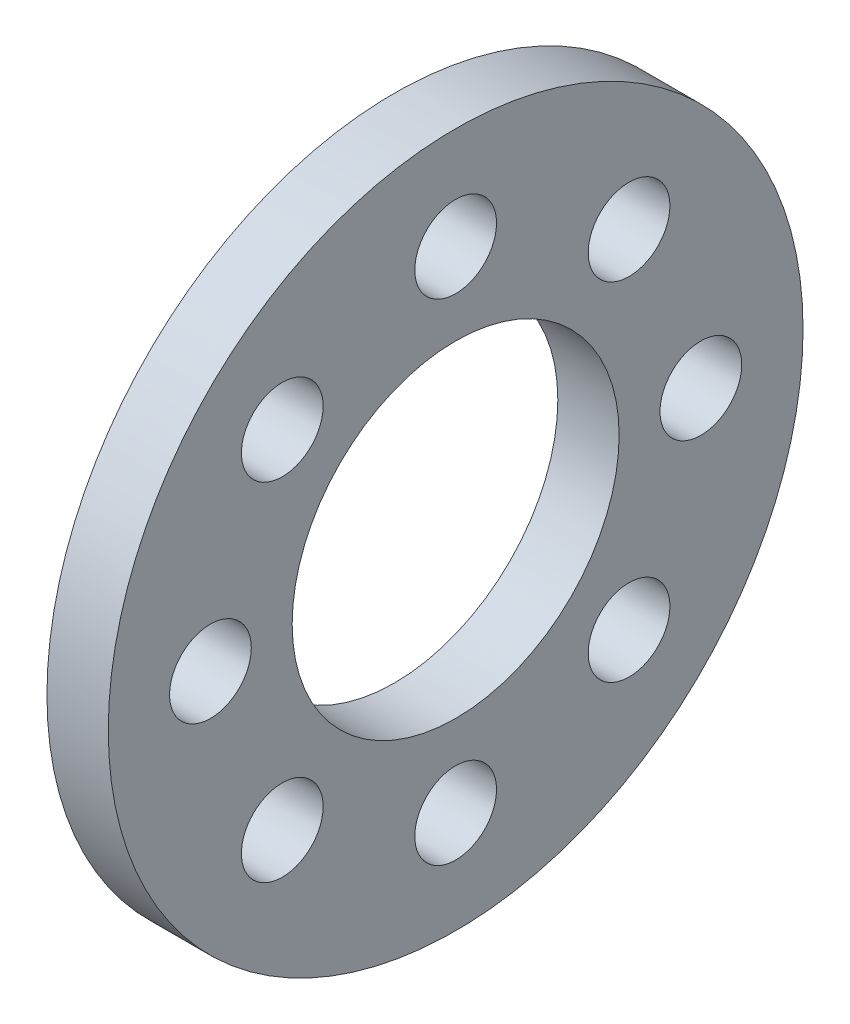
ISO-10303-21;
HEADER;
FILE_DESCRIPTION(('STEP AP214'),'2;1');
FILE_NAME('part.step','',(''),(''),'','','');
FILE_SCHEMA(('AUTOMOTIVE_DESIGN { 1 0 10303 214 1 1 1 1 }'));
ENDSEC;
DATA;
#1=APPLICATION_CONTEXT('core data for automotive mechanical design processes');
#2=APPLICATION_PROTOCOL_DEFINITION('international standard','automotive_design',2000,#1);
#3=PRODUCT_CONTEXT('',#1,'mechanical');
#4=PRODUCT('Part','Part','',(#3));
#5=PRODUCT_RELATED_PRODUCT_CATEGORY('part','',(#4));
#6=PRODUCT_DEFINITION_FORMATION('','',#4);
#7=PRODUCT_DEFINITION_CONTEXT('part definition',#1,'design');
#8=PRODUCT_DEFINITION('design','',#6,#7);
#9=PRODUCT_DEFINITION_SHAPE('','',#8);
#10=(LENGTH_UNIT() NAMED_UNIT(*) SI_UNIT(.MILLI.,.METRE.));
#11=(NAMED_UNIT(*) PLANE_ANGLE_UNIT() SI_UNIT($,.RADIAN.));
#12=(NAMED_UNIT(*) SI_UNIT($,.STERADIAN.) SOLID_ANGLE_UNIT());
#13=UNCERTAINTY_MEASURE_WITH_UNIT(LENGTH_MEASURE(1.E-05),#10,'distance_accuracy_value','');
#14=(GEOMETRIC_REPRESENTATION_CONTEXT(3) GLOBAL_UNCERTAINTY_ASSIGNED_CONTEXT((#13)) GLOBAL_UNIT_ASSIGNED_CONTEXT((#10,
#11,#12)) REPRESENTATION_CONTEXT('',''));
#15=CARTESIAN_POINT('',(0.,0.,0.));
#16=DIRECTION('',(0.,0.,1.));
#17=DIRECTION('',(1.,0.,0.));
#18=AXIS2_PLACEMENT_3D('',#15,#16,#17);
#19=CARTESIAN_POINT('',(3.,0.,0.));
#20=DIRECTION('',(1.,0.,0.));
#21=DIRECTION('',(0.,0.,-1.));
#22=AXIS2_PLACEMENT_3D('',#19,#20,#21);
#23=PLANE('',#22);
#24=CARTESIAN_POINT('',(3.,-5.11590769747272E-13,11.9999999999995));
#25=DIRECTION('',(1.,0.,0.));
#26=DIRECTION('',(0.,0.,-1.));
#27=AXIS2_PLACEMENT_3D('',#24,#25,#26);
#28=CIRCLE('',#27,2.00000000000076);
#29=CARTESIAN_POINT('',(3.,-5.11590769747272E-13,9.99999999999873));
#30=VERTEX_POINT('',#29);
#31=EDGE_CURVE('E94',#30,#30,#28,.T.);
#32=ORIENTED_EDGE('',*,*,#31,.F.);
#33=EDGE_LOOP('',(#32));
#34=FACE_BOUND('',#33,.T.);
#35=CARTESIAN_POINT('',(3.,-12.,-1.02024238717659E-12));
#36=DIRECTION('',(1.,0.,0.));
#37=DIRECTION('',(0.,0.,-1.));
#38=AXIS2_PLACEMENT_3D('',#35,#36,#37);
#39=CIRCLE('',#38,2.00000000000106);
#40=CARTESIAN_POINT('',(3.,-12.,-2.00000000000208));
#41=VERTEX_POINT('',#40);
#42=EDGE_CURVE('E82',#41,#41,#39,.T.);
#43=ORIENTED_EDGE('',*,*,#42,.F.);
#44=EDGE_LOOP('',(#43));
#45=FACE_BOUND('',#44,.T.);
#46=CARTESIAN_POINT('',(3.,5.10121193588295E-13,-12.0000000000005));
#47=DIRECTION('',(1.,0.,0.));
#48=DIRECTION('',(0.,0.,-1.));
#49=AXIS2_PLACEMENT_3D('',#46,#47,#48);
#50=CIRCLE('',#49,2.00000000000038);
#51=CARTESIAN_POINT('',(3.,5.10121193588295E-13,-14.0000000000009));
#52=VERTEX_POINT('',#51);
#53=EDGE_CURVE('E70',#52,#52,#50,.T.);
#54=ORIENTED_EDGE('',*,*,#53,.F.);
#55=EDGE_LOOP('',(#54));
#56=FACE_BOUND('',#55,.T.);
#57=CARTESIAN_POINT('',(3.,0.,0.));
#58=DIRECTION('',(1.,0.,0.));
#59=DIRECTION('',(0.,0.,-1.));
#60=AXIS2_PLACEMENT_3D('',#57,#58,#59);
#61=CIRCLE('',#60,8.);
#62=CARTESIAN_POINT('',(3.,0.,-8.));
#63=VERTEX_POINT('',#62);
#64=EDGE_CURVE('E58',#63,#63,#61,.T.);
#65=ORIENTED_EDGE('',*,*,#64,.F.);
#66=EDGE_LOOP('',(#65));
#67=FACE_BOUND('',#66,.T.);
#68=CARTESIAN_POINT('',(3.,0.,0.));
#69=DIRECTION('',(1.,0.,0.));
#70=DIRECTION('',(0.,0.,-1.));
#71=AXIS2_PLACEMENT_3D('',#68,#69,#70);
#72=CIRCLE('',#71,17.);
#73=CARTESIAN_POINT('',(3.,0.,-17.));
#74=VERTEX_POINT('',#73);
#75=EDGE_CURVE('E45',#74,#74,#72,.T.);
#76=ORIENTED_EDGE('',*,*,#75,.T.);
#77=EDGE_LOOP('',(#76));
#78=FACE_BOUND('',#77,.T.);
#79=CARTESIAN_POINT('',(3.,12.,0.));
#80=DIRECTION('',(1.,0.,0.));
#81=DIRECTION('',(0.,0.,-1.));
#82=AXIS2_PLACEMENT_3D('',#79,#80,#81);
#83=CIRCLE('',#82,2.);
#84=CARTESIAN_POINT('',(3.,12.,-2.));
#85=VERTEX_POINT('',#84);
#86=EDGE_CURVE('E53',#85,#85,#83,.T.);
#87=ORIENTED_EDGE('',*,*,#86,.F.);
#88=EDGE_LOOP('',(#87));
#89=FACE_BOUND('',#88,.T.);
#90=CARTESIAN_POINT('',(3.,8.48528137423893,-8.48528137423872));
#91=DIRECTION('',(1.,0.,0.));
#92=DIRECTION('',(0.,0.,-1.));
#93=AXIS2_PLACEMENT_3D('',#90,#91,#92);
#94=CIRCLE('',#93,2.00000000000006);
#95=CARTESIAN_POINT('',(3.,8.48528137423893,-10.4852813742388));
#96=VERTEX_POINT('',#95);
#97=EDGE_CURVE('E64',#96,#96,#94,.T.);
#98=ORIENTED_EDGE('',*,*,#97,.F.);
#99=EDGE_LOOP('',(#98));
#100=FACE_BOUND('',#99,.T.);
#101=CARTESIAN_POINT('',(3.,-8.48528137423821,-8.48528137423944));
#102=DIRECTION('',(1.,0.,0.));
#103=DIRECTION('',(0.,0.,-1.));
#104=AXIS2_PLACEMENT_3D('',#101,#102,#103);
#105=CIRCLE('',#104,2.00000000000079);
#106=CARTESIAN_POINT('',(3.,-8.48528137423821,-10.4852813742402));
#107=VERTEX_POINT('',#106);
#108=EDGE_CURVE('E76',#107,#107,#105,.T.);
#109=ORIENTED_EDGE('',*,*,#108,.F.);
#110=EDGE_LOOP('',(#109));
#111=FACE_BOUND('',#110,.T.);
#112=CARTESIAN_POINT('',(3.,-8.48528137423893,8.4852813742377));
#113=DIRECTION('',(1.,0.,0.));
#114=DIRECTION('',(0.,0.,-1.));
#115=AXIS2_PLACEMENT_3D('',#112,#113,#114);
#116=CIRCLE('',#115,2.00000000000104);
#117=CARTESIAN_POINT('',(3.,-8.48528137423893,6.48528137423666));
#118=VERTEX_POINT('',#117);
#119=EDGE_CURVE('E88',#118,#118,#116,.T.);
#120=ORIENTED_EDGE('',*,*,#119,.F.);
#121=EDGE_LOOP('',(#120));
#122=FACE_BOUND('',#121,.T.);
#123=CARTESIAN_POINT('',(3.,8.48528137423821,8.48528137423842));
#124=DIRECTION('',(1.,0.,0.));
#125=DIRECTION('',(0.,0.,-1.));
#126=AXIS2_PLACEMENT_3D('',#123,#124,#125);
#127=CIRCLE('',#126,2.00000000000039);
#128=CARTESIAN_POINT('',(3.,8.48528137423821,6.48528137423803));
#129=VERTEX_POINT('',#128);
#130=EDGE_CURVE('E100',#129,#129,#127,.T.);
#131=ORIENTED_EDGE('',*,*,#130,.F.);
#132=EDGE_LOOP('',(#131));
#133=FACE_BOUND('',#132,.T.);
#134=ADVANCED_FACE('F34',(#34,#45,#56,#67,#78,#89,#100,#111,#122,#133),#23,.T.);
#135=CARTESIAN_POINT('',(0.,0.,0.));
#136=DIRECTION('',(1.,0.,0.));
#137=DIRECTION('',(0.,0.,-1.));
#138=AXIS2_PLACEMENT_3D('',#135,#136,#137);
#139=PLANE('',#138);
#140=CARTESIAN_POINT('',(0.,-12.6107394548268,4.81863574079578));
#141=DIRECTION('',(1.,0.,0.));
#142=DIRECTION('',(0.,0.,-1.));
#143=AXIS2_PLACEMENT_3D('',#140,#141,#142);
#144=CIRCLE('',#143,1.25);
#145=CARTESIAN_POINT('',(0.,-12.6107394548268,3.56863574079578));
#146=VERTEX_POINT('',#145);
#147=EDGE_CURVE('E10',#146,#146,#144,.F.);
#148=ORIENTED_EDGE('',*,*,#147,.F.);
#149=EDGE_LOOP('',(#148));
#150=FACE_BOUND('',#149,.T.);
#151=CARTESIAN_POINT('',(0.,12.6107394548268,-4.81863574079578));
#152=DIRECTION('',(1.,0.,0.));
#153=DIRECTION('',(0.,0.,-1.));
#154=AXIS2_PLACEMENT_3D('',#151,#152,#153);
#155=CIRCLE('',#154,1.25);
#156=CARTESIAN_POINT('',(0.,12.6107394548268,-6.06863574079578));
#157=VERTEX_POINT('',#156);
#158=EDGE_CURVE('E41',#157,#157,#155,.F.);
#159=ORIENTED_EDGE('',*,*,#158,.F.);
#160=EDGE_LOOP('',(#159));
#161=FACE_BOUND('',#160,.T.);
#162=CARTESIAN_POINT('',(0.,0.,0.));
#163=DIRECTION('',(1.,0.,0.));
#164=DIRECTION('',(0.,0.,-1.));
#165=AXIS2_PLACEMENT_3D('',#162,#163,#164);
#166=CIRCLE('',#165,17.);
#167=CARTESIAN_POINT('',(0.,0.,-17.));
#168=VERTEX_POINT('',#167);
#169=EDGE_CURVE('E49',#168,#168,#166,.T.);
#170=ORIENTED_EDGE('',*,*,#169,.F.);
#171=EDGE_LOOP('',(#170));
#172=FACE_BOUND('',#171,.T.);
#173=CARTESIAN_POINT('',(0.,12.,0.));
#174=DIRECTION('',(1.,0.,0.));
#175=DIRECTION('',(0.,0.,-1.));
#176=AXIS2_PLACEMENT_3D('',#173,#174,#175);
#177=CIRCLE('',#176,2.);
#178=CARTESIAN_POINT('',(0.,12.,-2.));
#179=VERTEX_POINT('',#178);
#180=EDGE_CURVE('E55',#179,#179,#177,.T.);
#181=ORIENTED_EDGE('',*,*,#180,.T.);
#182=EDGE_LOOP('',(#181));
#183=FACE_BOUND('',#182,.T.);
#184=CARTESIAN_POINT('',(0.,0.,0.));
#185=DIRECTION('',(1.,0.,0.));
#186=DIRECTION('',(0.,0.,-1.));
#187=AXIS2_PLACEMENT_3D('',#184,#185,#186);
#188=CIRCLE('',#187,8.);
#189=CARTESIAN_POINT('',(0.,0.,-8.));
#190=VERTEX_POINT('',#189);
#191=EDGE_CURVE('E61',#190,#190,#188,.T.);
#192=ORIENTED_EDGE('',*,*,#191,.T.);
#193=EDGE_LOOP('',(#192));
#194=FACE_BOUND('',#193,.T.);
#195=CARTESIAN_POINT('',(0.,8.48528137423893,-8.48528137423872));
#196=DIRECTION('',(1.,0.,0.));
#197=DIRECTION('',(0.,0.,-1.));
#198=AXIS2_PLACEMENT_3D('',#195,#196,#197);
#199=CIRCLE('',#198,2.00000000000006);
#200=CARTESIAN_POINT('',(0.,8.48528137423893,-10.4852813742388));
#201=VERTEX_POINT('',#200);
#202=EDGE_CURVE('E67',#201,#201,#199,.T.);
#203=ORIENTED_EDGE('',*,*,#202,.T.);
#204=EDGE_LOOP('',(#203));
#205=FACE_BOUND('',#204,.T.);
#206=CARTESIAN_POINT('',(0.,5.10121193588295E-13,-12.0000000000005));
#207=DIRECTION('',(1.,0.,0.));
#208=DIRECTION('',(0.,0.,-1.));
#209=AXIS2_PLACEMENT_3D('',#206,#207,#208);
#210=CIRCLE('',#209,2.00000000000038);
#211=CARTESIAN_POINT('',(0.,5.10121193588295E-13,-14.0000000000009));
#212=VERTEX_POINT('',#211);
#213=EDGE_CURVE('E73',#212,#212,#210,.T.);
#214=ORIENTED_EDGE('',*,*,#213,.T.);
#215=EDGE_LOOP('',(#214));
#216=FACE_BOUND('',#215,.T.);
#217=CARTESIAN_POINT('',(0.,-8.48528137423821,-8.48528137423944));
#218=DIRECTION('',(1.,0.,0.));
#219=DIRECTION('',(0.,0.,-1.));
#220=AXIS2_PLACEMENT_3D('',#217,#218,#219);
#221=CIRCLE('',#220,2.00000000000079);
#222=CARTESIAN_POINT('',(0.,-8.48528137423821,-10.4852813742402));
#223=VERTEX_POINT('',#222);
#224=EDGE_CURVE('E79',#223,#223,#221,.T.);
#225=ORIENTED_EDGE('',*,*,#224,.T.);
#226=EDGE_LOOP('',(#225));
#227=FACE_BOUND('',#226,.T.);
#228=CARTESIAN_POINT('',(0.,-12.,-1.02024238717659E-12));
#229=DIRECTION('',(1.,0.,0.));
#230=DIRECTION('',(0.,0.,-1.));
#231=AXIS2_PLACEMENT_3D('',#228,#229,#230);
#232=CIRCLE('',#231,2.00000000000106);
#233=CARTESIAN_POINT('',(0.,-12.,-2.00000000000208));
#234=VERTEX_POINT('',#233);
#235=EDGE_CURVE('E85',#234,#234,#232,.T.);
#236=ORIENTED_EDGE('',*,*,#235,.T.);
#237=EDGE_LOOP('',(#236));
#238=FACE_BOUND('',#237,.T.);
#239=CARTESIAN_POINT('',(0.,-8.48528137423893,8.4852813742377));
#240=DIRECTION('',(1.,0.,0.));
#241=DIRECTION('',(0.,0.,-1.));
#242=AXIS2_PLACEMENT_3D('',#239,#240,#241);
#243=CIRCLE('',#242,2.00000000000104);
#244=CARTESIAN_POINT('',(0.,-8.48528137423893,6.48528137423666));
#245=VERTEX_POINT('',#244);
#246=EDGE_CURVE('E91',#245,#245,#243,.T.);
#247=ORIENTED_EDGE('',*,*,#246,.T.);
#248=EDGE_LOOP('',(#247));
#249=FACE_BOUND('',#248,.T.);
#250=CARTESIAN_POINT('',(0.,-5.11590769747272E-13,11.9999999999995));
#251=DIRECTION('',(1.,0.,0.));
#252=DIRECTION('',(0.,0.,-1.));
#253=AXIS2_PLACEMENT_3D('',#250,#251,#252);
#254=CIRCLE('',#253,2.00000000000076);
#255=CARTESIAN_POINT('',(0.,-5.11590769747272E-13,9.99999999999873));
#256=VERTEX_POINT('',#255);
#257=EDGE_CURVE('E97',#256,#256,#254,.T.);
#258=ORIENTED_EDGE('',*,*,#257,.T.);
#259=EDGE_LOOP('',(#258));
#260=FACE_BOUND('',#259,.T.);
#261=CARTESIAN_POINT('',(0.,8.48528137423821,8.48528137423842));
#262=DIRECTION('',(1.,0.,0.));
#263=DIRECTION('',(0.,0.,-1.));
#264=AXIS2_PLACEMENT_3D('',#261,#262,#263);
#265=CIRCLE('',#264,2.00000000000039);
#266=CARTESIAN_POINT('',(0.,8.48528137423821,6.48528137423803));
#267=VERTEX_POINT('',#266);
#268=EDGE_CURVE('E103',#267,#267,#265,.T.);
#269=ORIENTED_EDGE('',*,*,#268,.T.);
#270=EDGE_LOOP('',(#269));
#271=FACE_BOUND('',#270,.T.);
#272=ADVANCED_FACE('F130',(#150,#161,#172,#183,#194,#205,#216,#227,#238,#249,#260,#271),#139,.F.);
#273=CARTESIAN_POINT('',(3.,0.,0.));
#274=DIRECTION('',(-1.,0.,0.));
#275=DIRECTION('',(0.,0.,1.));
#276=AXIS2_PLACEMENT_3D('',#273,#274,#275);
#277=CYLINDRICAL_SURFACE('',#276,17.);
#278=ORIENTED_EDGE('',*,*,#75,.F.);
#279=EDGE_LOOP('',(#278));
#280=FACE_BOUND('',#279,.T.);
#281=ORIENTED_EDGE('',*,*,#169,.T.);
#282=EDGE_LOOP('',(#281));
#283=FACE_BOUND('',#282,.T.);
#284=ADVANCED_FACE('F36',(#280,#283),#277,.T.);
#285=CARTESIAN_POINT('',(3.,12.,0.));
#286=DIRECTION('',(-1.,0.,0.));
#287=DIRECTION('',(0.,0.,1.));
#288=AXIS2_PLACEMENT_3D('',#285,#286,#287);
#289=CYLINDRICAL_SURFACE('',#288,2.);
#290=ORIENTED_EDGE('',*,*,#86,.T.);
#291=EDGE_LOOP('',(#290));
#292=FACE_BOUND('',#291,.T.);
#293=ORIENTED_EDGE('',*,*,#180,.F.);
#294=EDGE_LOOP('',(#293));
#295=FACE_BOUND('',#294,.T.);
#296=ADVANCED_FACE('F140',(#292,#295),#289,.F.);
#297=CARTESIAN_POINT('',(3.,0.,0.));
#298=DIRECTION('',(-1.,0.,0.));
#299=DIRECTION('',(0.,0.,1.));
#300=AXIS2_PLACEMENT_3D('',#297,#298,#299);
#301=CYLINDRICAL_SURFACE('',#300,8.);
#302=ORIENTED_EDGE('',*,*,#64,.T.);
#303=EDGE_LOOP('',(#302));
#304=FACE_BOUND('',#303,.T.);
#305=ORIENTED_EDGE('',*,*,#191,.F.);
#306=EDGE_LOOP('',(#305));
#307=FACE_BOUND('',#306,.T.);
#308=ADVANCED_FACE('F143',(#304,#307),#301,.F.);
#309=CARTESIAN_POINT('',(3.,8.48528137423893,-8.48528137423872));
#310=DIRECTION('',(-1.,0.,0.));
#311=DIRECTION('',(0.,0.,1.));
#312=AXIS2_PLACEMENT_3D('',#309,#310,#311);
#313=CYLINDRICAL_SURFACE('',#312,2.00000000000006);
#314=ORIENTED_EDGE('',*,*,#97,.T.);
#315=EDGE_LOOP('',(#314));
#316=FACE_BOUND('',#315,.T.);
#317=ORIENTED_EDGE('',*,*,#202,.F.);
#318=EDGE_LOOP('',(#317));
#319=FACE_BOUND('',#318,.T.);
#320=ADVANCED_FACE('F147',(#316,#319),#313,.F.);
#321=CARTESIAN_POINT('',(3.,5.10121193588295E-13,-12.0000000000005));
#322=DIRECTION('',(-1.,0.,0.));
#323=DIRECTION('',(0.,0.,1.));
#324=AXIS2_PLACEMENT_3D('',#321,#322,#323);
#325=CYLINDRICAL_SURFACE('',#324,2.00000000000038);
#326=ORIENTED_EDGE('',*,*,#53,.T.);
#327=EDGE_LOOP('',(#326));
#328=FACE_BOUND('',#327,.T.);
#329=ORIENTED_EDGE('',*,*,#213,.F.);
#330=EDGE_LOOP('',(#329));
#331=FACE_BOUND('',#330,.T.);
#332=ADVANCED_FACE('F151',(#328,#331),#325,.F.);
#333=CARTESIAN_POINT('',(3.,-8.48528137423821,-8.48528137423944));
#334=DIRECTION('',(-1.,0.,0.));
#335=DIRECTION('',(0.,0.,1.));
#336=AXIS2_PLACEMENT_3D('',#333,#334,#335);
#337=CYLINDRICAL_SURFACE('',#336,2.00000000000079);
#338=ORIENTED_EDGE('',*,*,#108,.T.);
#339=EDGE_LOOP('',(#338));
#340=FACE_BOUND('',#339,.T.);
#341=ORIENTED_EDGE('',*,*,#224,.F.);
#342=EDGE_LOOP('',(#341));
#343=FACE_BOUND('',#342,.T.);
#344=ADVANCED_FACE('F155',(#340,#343),#337,.F.);
#345=CARTESIAN_POINT('',(3.,-12.,-1.02024238717659E-12));
#346=DIRECTION('',(-1.,0.,0.));
#347=DIRECTION('',(0.,0.,1.));
#348=AXIS2_PLACEMENT_3D('',#345,#346,#347);
#349=CYLINDRICAL_SURFACE('',#348,2.00000000000106);
#350=ORIENTED_EDGE('',*,*,#42,.T.);
#351=EDGE_LOOP('',(#350));
#352=FACE_BOUND('',#351,.T.);
#353=ORIENTED_EDGE('',*,*,#235,.F.);
#354=EDGE_LOOP('',(#353));
#355=FACE_BOUND('',#354,.T.);
#356=ADVANCED_FACE('F159',(#352,#355),#349,.F.);
#357=CARTESIAN_POINT('',(3.,-8.48528137423893,8.4852813742377));
#358=DIRECTION('',(-1.,0.,0.));
#359=DIRECTION('',(0.,0.,1.));
#360=AXIS2_PLACEMENT_3D('',#357,#358,#359);
#361=CYLINDRICAL_SURFACE('',#360,2.00000000000104);
#362=ORIENTED_EDGE('',*,*,#119,.T.);
#363=EDGE_LOOP('',(#362));
#364=FACE_BOUND('',#363,.T.);
#365=ORIENTED_EDGE('',*,*,#246,.F.);
#366=EDGE_LOOP('',(#365));
#367=FACE_BOUND('',#366,.T.);
#368=ADVANCED_FACE('F163',(#364,#367),#361,.F.);
#369=CARTESIAN_POINT('',(3.,-5.11590769747272E-13,11.9999999999995));
#370=DIRECTION('',(-1.,0.,0.));
#371=DIRECTION('',(0.,0.,1.));
#372=AXIS2_PLACEMENT_3D('',#369,#370,#371);
#373=CYLINDRICAL_SURFACE('',#372,2.00000000000076);
#374=ORIENTED_EDGE('',*,*,#31,.T.);
#375=EDGE_LOOP('',(#374));
#376=FACE_BOUND('',#375,.T.);
#377=ORIENTED_EDGE('',*,*,#257,.F.);
#378=EDGE_LOOP('',(#377));
#379=FACE_BOUND('',#378,.T.);
#380=ADVANCED_FACE('F167',(#376,#379),#373,.F.);
#381=CARTESIAN_POINT('',(3.,8.48528137423821,8.48528137423842));
#382=DIRECTION('',(-1.,0.,0.));
#383=DIRECTION('',(0.,0.,1.));
#384=AXIS2_PLACEMENT_3D('',#381,#382,#383);
#385=CYLINDRICAL_SURFACE('',#384,2.00000000000039);
#386=ORIENTED_EDGE('',*,*,#130,.T.);
#387=EDGE_LOOP('',(#386));
#388=FACE_BOUND('',#387,.T.);
#389=ORIENTED_EDGE('',*,*,#268,.F.);
#390=EDGE_LOOP('',(#389));
#391=FACE_BOUND('',#390,.T.);
#392=ADVANCED_FACE('F171',(#388,#391),#385,.F.);
#393=CARTESIAN_POINT('',(-3.,12.6107394548268,-4.81863574079578));
#394=DIRECTION('',(1.,0.,0.));
#395=DIRECTION('',(0.,0.,-1.));
#396=AXIS2_PLACEMENT_3D('',#393,#394,#395);
#397=CYLINDRICAL_SURFACE('',#396,1.25);
#398=CARTESIAN_POINT('',(-3.,12.6107394548268,-4.81863574079578));
#399=DIRECTION('',(-1.,0.,0.));
#400=DIRECTION('',(0.,0.,1.));
#401=AXIS2_PLACEMENT_3D('',#398,#399,#400);
#402=CIRCLE('',#401,1.25);
#403=CARTESIAN_POINT('',(-3.,12.6107394548268,-3.56863574079578));
#404=VERTEX_POINT('',#403);
#405=EDGE_CURVE('E106',#404,#404,#402,.T.);
#406=ORIENTED_EDGE('',*,*,#405,.F.);
#407=EDGE_LOOP('',(#406));
#408=FACE_BOUND('',#407,.T.);
#409=ORIENTED_EDGE('',*,*,#158,.T.);
#410=EDGE_LOOP('',(#409));
#411=FACE_BOUND('',#410,.T.);
#412=ADVANCED_FACE('F126',(#408,#411),#397,.T.);
#413=CARTESIAN_POINT('',(-3.,12.6107394548268,-4.81863574079578));
#414=DIRECTION('',(-1.,0.,0.));
#415=DIRECTION('',(0.,0.,1.));
#416=AXIS2_PLACEMENT_3D('',#413,#414,#415);
#417=PLANE('',#416);
#418=ORIENTED_EDGE('',*,*,#405,.T.);
#419=EDGE_LOOP('',(#418));
#420=FACE_BOUND('',#419,.T.);
#421=ADVANCED_FACE('F119',(#420),#417,.T.);
#422=CARTESIAN_POINT('',(-3.,-12.6107394548268,4.81863574079578));
#423=DIRECTION('',(1.,0.,0.));
#424=DIRECTION('',(0.,0.,-1.));
#425=AXIS2_PLACEMENT_3D('',#422,#423,#424);
#426=CYLINDRICAL_SURFACE('',#425,1.25);
#427=CARTESIAN_POINT('',(-3.,-12.6107394548268,4.81863574079578));
#428=DIRECTION('',(-1.,0.,0.));
#429=DIRECTION('',(0.,0.,1.));
#430=AXIS2_PLACEMENT_3D('',#427,#428,#429);
#431=CIRCLE('',#430,1.25);
#432=CARTESIAN_POINT('',(-3.,-12.6107394548268,6.06863574079578));
#433=VERTEX_POINT('',#432);
#434=EDGE_CURVE('E111',#433,#433,#431,.T.);
#435=ORIENTED_EDGE('',*,*,#434,.F.);
#436=EDGE_LOOP('',(#435));
#437=FACE_BOUND('',#436,.T.);
#438=ORIENTED_EDGE('',*,*,#147,.T.);
#439=EDGE_LOOP('',(#438));
#440=FACE_BOUND('',#439,.T.);
#441=ADVANCED_FACE('F117',(#437,#440),#426,.T.);
#442=CARTESIAN_POINT('',(-3.,-12.6107394548268,4.81863574079578));
#443=DIRECTION('',(-1.,0.,0.));
#444=DIRECTION('',(0.,0.,1.));
#445=AXIS2_PLACEMENT_3D('',#442,#443,#444);
#446=PLANE('',#445);
#447=ORIENTED_EDGE('',*,*,#434,.T.);
#448=EDGE_LOOP('',(#447));
#449=FACE_BOUND('',#448,.T.);
#450=ADVANCED_FACE('F115',(#449),#446,.T.);
#451=CLOSED_SHELL('',(#134,#272,#284,#296,#308,#320,#332,#344,#356,#368,#380,#392,#412,#421,
#441,#450));
#452=MANIFOLD_SOLID_BREP('B2',#451);
#453=ADVANCED_BREP_SHAPE_REPRESENTATION('',(#18,#452),#14);
#454=SHAPE_DEFINITION_REPRESENTATION(#9,#453);
ENDSEC;
END-ISO-10303-21;
